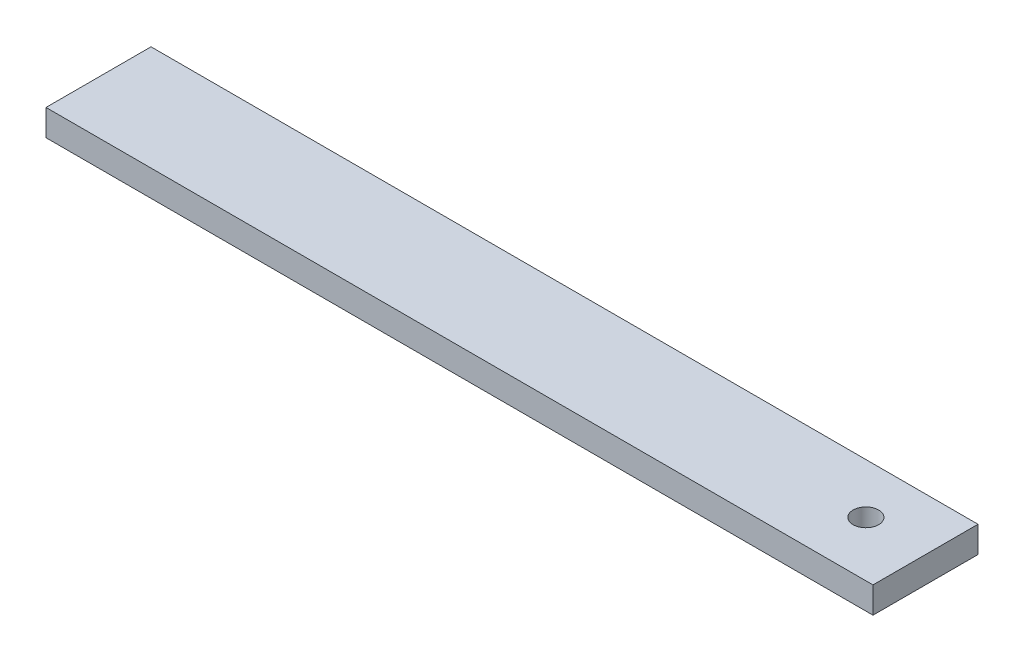
ISO-10303-21;
HEADER;
FILE_DESCRIPTION(('STEP AP214'),'2;1');
FILE_NAME('part.step','',(''),(''),'','','');
FILE_SCHEMA(('AUTOMOTIVE_DESIGN { 1 0 10303 214 1 1 1 1 }'));
ENDSEC;
DATA;
#1=APPLICATION_CONTEXT('core data for automotive mechanical design processes');
#2=APPLICATION_PROTOCOL_DEFINITION('international standard','automotive_design',2000,#1);
#3=PRODUCT_CONTEXT('',#1,'mechanical');
#4=PRODUCT('Part','Part','',(#3));
#5=PRODUCT_RELATED_PRODUCT_CATEGORY('part','',(#4));
#6=PRODUCT_DEFINITION_FORMATION('','',#4);
#7=PRODUCT_DEFINITION_CONTEXT('part definition',#1,'design');
#8=PRODUCT_DEFINITION('design','',#6,#7);
#9=PRODUCT_DEFINITION_SHAPE('','',#8);
#10=(LENGTH_UNIT() NAMED_UNIT(*) SI_UNIT(.MILLI.,.METRE.));
#11=(NAMED_UNIT(*) PLANE_ANGLE_UNIT() SI_UNIT($,.RADIAN.));
#12=(NAMED_UNIT(*) SI_UNIT($,.STERADIAN.) SOLID_ANGLE_UNIT());
#13=UNCERTAINTY_MEASURE_WITH_UNIT(LENGTH_MEASURE(1.E-05),#10,'distance_accuracy_value','');
#14=(GEOMETRIC_REPRESENTATION_CONTEXT(3) GLOBAL_UNCERTAINTY_ASSIGNED_CONTEXT((#13)) GLOBAL_UNIT_ASSIGNED_CONTEXT((#10,
#11,#12)) REPRESENTATION_CONTEXT('',''));
#15=CARTESIAN_POINT('',(0.,0.,0.));
#16=DIRECTION('',(0.,0.,1.));
#17=DIRECTION('',(1.,0.,0.));
#18=AXIS2_PLACEMENT_3D('',#15,#16,#17);
#19=CARTESIAN_POINT('',(0.,3.175,0.));
#20=DIRECTION('',(0.,-1.,0.));
#21=DIRECTION('',(0.,0.,-1.));
#22=AXIS2_PLACEMENT_3D('',#19,#20,#21);
#23=PLANE('',#22);
#24=DIRECTION('',(0.,0.,1.));
#25=VECTOR('',#24,1.);
#26=CARTESIAN_POINT('',(0.,3.175,0.));
#27=LINE('',#26,#25);
#28=CARTESIAN_POINT('',(0.,3.175,-12.7));
#29=VERTEX_POINT('',#28);
#30=CARTESIAN_POINT('',(0.,3.175,0.));
#31=VERTEX_POINT('',#30);
#32=EDGE_CURVE('E85',#29,#31,#27,.T.);
#33=ORIENTED_EDGE('',*,*,#32,.T.);
#34=DIRECTION('',(1.,0.,0.));
#35=VECTOR('',#34,1.);
#36=CARTESIAN_POINT('',(0.,3.175,0.));
#37=LINE('',#36,#35);
#38=CARTESIAN_POINT('',(100.,3.175,0.));
#39=VERTEX_POINT('',#38);
#40=EDGE_CURVE('E80',#31,#39,#37,.T.);
#41=ORIENTED_EDGE('',*,*,#40,.T.);
#42=DIRECTION('',(0.,0.,-1.));
#43=VECTOR('',#42,1.);
#44=CARTESIAN_POINT('',(100.,3.175,0.));
#45=LINE('',#44,#43);
#46=CARTESIAN_POINT('',(100.,3.175,-12.7));
#47=VERTEX_POINT('',#46);
#48=EDGE_CURVE('E83',#39,#47,#45,.T.);
#49=ORIENTED_EDGE('',*,*,#48,.T.);
#50=DIRECTION('',(-1.,0.,0.));
#51=VECTOR('',#50,1.);
#52=CARTESIAN_POINT('',(0.,3.175,-12.7));
#53=LINE('',#52,#51);
#54=EDGE_CURVE('E50',#47,#29,#53,.T.);
#55=ORIENTED_EDGE('',*,*,#54,.T.);
#56=EDGE_LOOP('',(#33,#41,#49,#55));
#57=FACE_BOUND('',#56,.T.);
#58=CARTESIAN_POINT('',(92.500362967316,3.175,-6.64592594178853));
#59=DIRECTION('',(0.,1.,0.));
#60=DIRECTION('',(0.,0.,1.));
#61=AXIS2_PLACEMENT_3D('',#58,#59,#60);
#62=CIRCLE('',#61,1.54363836785158);
#63=CARTESIAN_POINT('',(92.500362967316,3.175,-5.10228757393694));
#64=VERTEX_POINT('',#63);
#65=EDGE_CURVE('E100',#64,#64,#62,.T.);
#66=ORIENTED_EDGE('',*,*,#65,.F.);
#67=EDGE_LOOP('',(#66));
#68=FACE_BOUND('',#67,.T.);
#69=ADVANCED_FACE('F33',(#57,#68),#23,.F.);
#70=CARTESIAN_POINT('',(0.,0.,0.));
#71=DIRECTION('',(0.,-1.,0.));
#72=DIRECTION('',(0.,0.,-1.));
#73=AXIS2_PLACEMENT_3D('',#70,#71,#72);
#74=PLANE('',#73);
#75=DIRECTION('',(0.,0.,1.));
#76=VECTOR('',#75,1.);
#77=CARTESIAN_POINT('',(0.,0.,0.));
#78=LINE('',#77,#76);
#79=CARTESIAN_POINT('',(0.,0.,-12.7));
#80=VERTEX_POINT('',#79);
#81=CARTESIAN_POINT('',(0.,0.,0.));
#82=VERTEX_POINT('',#81);
#83=EDGE_CURVE('E97',#80,#82,#78,.T.);
#84=ORIENTED_EDGE('',*,*,#83,.F.);
#85=DIRECTION('',(-1.,0.,0.));
#86=VECTOR('',#85,1.);
#87=CARTESIAN_POINT('',(0.,0.,-12.7));
#88=LINE('',#87,#86);
#89=CARTESIAN_POINT('',(100.,0.,-12.7));
#90=VERTEX_POINT('',#89);
#91=EDGE_CURVE('E73',#90,#80,#88,.T.);
#92=ORIENTED_EDGE('',*,*,#91,.F.);
#93=DIRECTION('',(0.,0.,-1.));
#94=VECTOR('',#93,1.);
#95=CARTESIAN_POINT('',(100.,0.,0.));
#96=LINE('',#95,#94);
#97=CARTESIAN_POINT('',(100.,0.,0.));
#98=VERTEX_POINT('',#97);
#99=EDGE_CURVE('E67',#98,#90,#96,.T.);
#100=ORIENTED_EDGE('',*,*,#99,.F.);
#101=DIRECTION('',(1.,0.,0.));
#102=VECTOR('',#101,1.);
#103=CARTESIAN_POINT('',(0.,0.,0.));
#104=LINE('',#103,#102);
#105=EDGE_CURVE('E89',#82,#98,#104,.T.);
#106=ORIENTED_EDGE('',*,*,#105,.F.);
#107=EDGE_LOOP('',(#84,#92,#100,#106));
#108=FACE_BOUND('',#107,.T.);
#109=CARTESIAN_POINT('',(92.500362967316,0.,-6.64592594178853));
#110=DIRECTION('',(0.,1.,0.));
#111=DIRECTION('',(0.,0.,1.));
#112=AXIS2_PLACEMENT_3D('',#109,#110,#111);
#113=CIRCLE('',#112,1.54363836785158);
#114=CARTESIAN_POINT('',(92.500362967316,0.,-5.10228757393694));
#115=VERTEX_POINT('',#114);
#116=EDGE_CURVE('E112',#115,#115,#113,.T.);
#117=ORIENTED_EDGE('',*,*,#116,.T.);
#118=EDGE_LOOP('',(#117));
#119=FACE_BOUND('',#118,.T.);
#120=ADVANCED_FACE('F108',(#108,#119),#74,.T.);
#121=CARTESIAN_POINT('',(0.,3.175,0.));
#122=DIRECTION('',(1.,0.,0.));
#123=DIRECTION('',(0.,0.,-1.));
#124=AXIS2_PLACEMENT_3D('',#121,#122,#123);
#125=PLANE('',#124);
#126=ORIENTED_EDGE('',*,*,#83,.T.);
#127=DIRECTION('',(0.,-1.,0.));
#128=VECTOR('',#127,1.);
#129=CARTESIAN_POINT('',(0.,3.175,0.));
#130=LINE('',#129,#128);
#131=EDGE_CURVE('E11',#31,#82,#130,.T.);
#132=ORIENTED_EDGE('',*,*,#131,.F.);
#133=ORIENTED_EDGE('',*,*,#32,.F.);
#134=DIRECTION('',(0.,-1.,0.));
#135=VECTOR('',#134,1.);
#136=CARTESIAN_POINT('',(0.,3.175,-12.7));
#137=LINE('',#136,#135);
#138=EDGE_CURVE('E93',#29,#80,#137,.T.);
#139=ORIENTED_EDGE('',*,*,#138,.T.);
#140=EDGE_LOOP('',(#126,#132,#133,#139));
#141=FACE_BOUND('',#140,.T.);
#142=ADVANCED_FACE('F35',(#141),#125,.F.);
#143=CARTESIAN_POINT('',(0.,3.175,0.));
#144=DIRECTION('',(0.,0.,-1.));
#145=DIRECTION('',(-1.,0.,0.));
#146=AXIS2_PLACEMENT_3D('',#143,#144,#145);
#147=PLANE('',#146);
#148=ORIENTED_EDGE('',*,*,#105,.T.);
#149=DIRECTION('',(0.,-1.,0.));
#150=VECTOR('',#149,1.);
#151=CARTESIAN_POINT('',(100.,3.175,0.));
#152=LINE('',#151,#150);
#153=EDGE_CURVE('E42',#39,#98,#152,.T.);
#154=ORIENTED_EDGE('',*,*,#153,.F.);
#155=ORIENTED_EDGE('',*,*,#40,.F.);
#156=ORIENTED_EDGE('',*,*,#131,.T.);
#157=EDGE_LOOP('',(#148,#154,#155,#156));
#158=FACE_BOUND('',#157,.T.);
#159=ADVANCED_FACE('F88',(#158),#147,.F.);
#160=CARTESIAN_POINT('',(100.,3.175,0.));
#161=DIRECTION('',(-1.,0.,0.));
#162=DIRECTION('',(0.,0.,1.));
#163=AXIS2_PLACEMENT_3D('',#160,#161,#162);
#164=PLANE('',#163);
#165=ORIENTED_EDGE('',*,*,#99,.T.);
#166=DIRECTION('',(0.,-1.,0.));
#167=VECTOR('',#166,1.);
#168=CARTESIAN_POINT('',(100.,3.175,-12.7));
#169=LINE('',#168,#167);
#170=EDGE_CURVE('E90',#47,#90,#169,.T.);
#171=ORIENTED_EDGE('',*,*,#170,.F.);
#172=ORIENTED_EDGE('',*,*,#48,.F.);
#173=ORIENTED_EDGE('',*,*,#153,.T.);
#174=EDGE_LOOP('',(#165,#171,#172,#173));
#175=FACE_BOUND('',#174,.T.);
#176=ADVANCED_FACE('F91',(#175),#164,.F.);
#177=CARTESIAN_POINT('',(0.,3.175,-12.7));
#178=DIRECTION('',(0.,0.,1.));
#179=DIRECTION('',(1.,0.,0.));
#180=AXIS2_PLACEMENT_3D('',#177,#178,#179);
#181=PLANE('',#180);
#182=ORIENTED_EDGE('',*,*,#91,.T.);
#183=ORIENTED_EDGE('',*,*,#138,.F.);
#184=ORIENTED_EDGE('',*,*,#54,.F.);
#185=ORIENTED_EDGE('',*,*,#170,.T.);
#186=EDGE_LOOP('',(#182,#183,#184,#185));
#187=FACE_BOUND('',#186,.T.);
#188=ADVANCED_FACE('F105',(#187),#181,.F.);
#189=CARTESIAN_POINT('',(92.500362967316,3.175,-6.64592594178853));
#190=DIRECTION('',(0.,-1.,0.));
#191=DIRECTION('',(0.,0.,-1.));
#192=AXIS2_PLACEMENT_3D('',#189,#190,#191);
#193=CYLINDRICAL_SURFACE('',#192,1.54363836785158);
#194=ORIENTED_EDGE('',*,*,#65,.T.);
#195=EDGE_LOOP('',(#194));
#196=FACE_BOUND('',#195,.T.);
#197=ORIENTED_EDGE('',*,*,#116,.F.);
#198=EDGE_LOOP('',(#197));
#199=FACE_BOUND('',#198,.T.);
#200=ADVANCED_FACE('F118',(#196,#199),#193,.F.);
#201=CLOSED_SHELL('',(#69,#120,#142,#159,#176,#188,#200));
#202=MANIFOLD_SOLID_BREP('B2',#201);
#203=ADVANCED_BREP_SHAPE_REPRESENTATION('',(#18,#202),#14);
#204=SHAPE_DEFINITION_REPRESENTATION(#9,#203);
ENDSEC;
END-ISO-10303-21;
